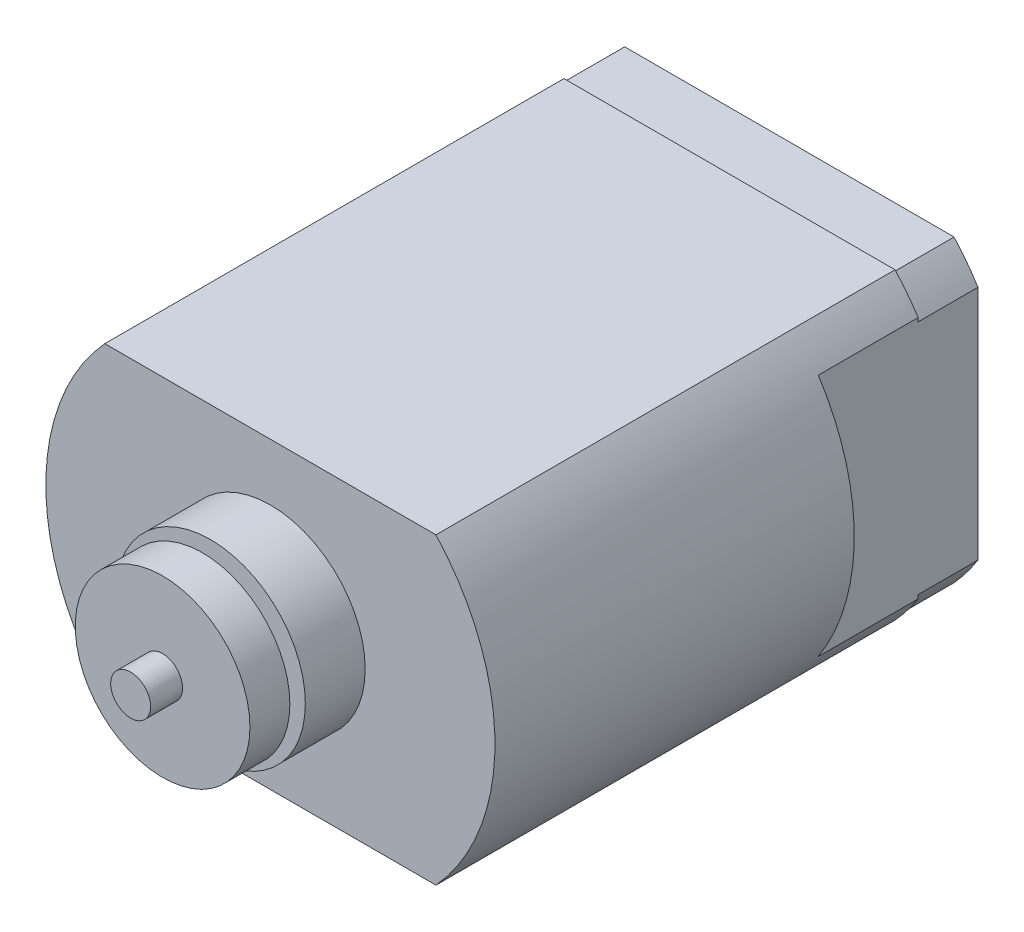
ISO-10303-21;
HEADER;
FILE_DESCRIPTION(('STEP AP214'),'2;1');
FILE_NAME('part.step','',(''),(''),'','','');
FILE_SCHEMA(('AUTOMOTIVE_DESIGN { 1 0 10303 214 1 1 1 1 }'));
ENDSEC;
DATA;
#1=APPLICATION_CONTEXT('core data for automotive mechanical design processes');
#2=APPLICATION_PROTOCOL_DEFINITION('international standard','automotive_design',2000,#1);
#3=PRODUCT_CONTEXT('',#1,'mechanical');
#4=PRODUCT('Part','Part','',(#3));
#5=PRODUCT_RELATED_PRODUCT_CATEGORY('part','',(#4));
#6=PRODUCT_DEFINITION_FORMATION('','',#4);
#7=PRODUCT_DEFINITION_CONTEXT('part definition',#1,'design');
#8=PRODUCT_DEFINITION('design','',#6,#7);
#9=PRODUCT_DEFINITION_SHAPE('','',#8);
#10=(LENGTH_UNIT() NAMED_UNIT(*) SI_UNIT(.MILLI.,.METRE.));
#11=(NAMED_UNIT(*) PLANE_ANGLE_UNIT() SI_UNIT($,.RADIAN.));
#12=(NAMED_UNIT(*) SI_UNIT($,.STERADIAN.) SOLID_ANGLE_UNIT());
#13=UNCERTAINTY_MEASURE_WITH_UNIT(LENGTH_MEASURE(1.E-05),#10,'distance_accuracy_value','');
#14=(GEOMETRIC_REPRESENTATION_CONTEXT(3) GLOBAL_UNCERTAINTY_ASSIGNED_CONTEXT((#13)) GLOBAL_UNIT_ASSIGNED_CONTEXT((#10,
#11,#12)) REPRESENTATION_CONTEXT('',''));
#15=CARTESIAN_POINT('',(0.,0.,0.));
#16=DIRECTION('',(0.,0.,1.));
#17=DIRECTION('',(1.,0.,0.));
#18=AXIS2_PLACEMENT_3D('',#15,#16,#17);
#19=CARTESIAN_POINT('',(0.,0.,3.));
#20=DIRECTION('',(0.,0.,-1.));
#21=DIRECTION('',(-1.,0.,0.));
#22=AXIS2_PLACEMENT_3D('',#19,#20,#21);
#23=CYLINDRICAL_SURFACE('',#22,11.15);
#24=DIRECTION('',(0.,0.,-1.));
#25=VECTOR('',#24,1.);
#26=CARTESIAN_POINT('',(9.45,5.9177698502054,3.));
#27=LINE('',#26,#25);
#28=CARTESIAN_POINT('',(9.45,5.9177698502054,0.));
#29=VERTEX_POINT('',#28);
#30=CARTESIAN_POINT('',(9.45,5.9177698502054,3.));
#31=VERTEX_POINT('',#30);
#32=EDGE_CURVE('E131',#29,#31,#27,.F.);
#33=ORIENTED_EDGE('',*,*,#32,.F.);
#34=CARTESIAN_POINT('',(0.,0.,0.));
#35=DIRECTION('',(0.,0.,-1.));
#36=DIRECTION('',(-1.,0.,0.));
#37=AXIS2_PLACEMENT_3D('',#34,#35,#36);
#38=CIRCLE('',#37,11.15);
#39=CARTESIAN_POINT('',(8.25060603834652,7.5,0.));
#40=VERTEX_POINT('',#39);
#41=EDGE_CURVE('E140',#40,#29,#38,.T.);
#42=ORIENTED_EDGE('',*,*,#41,.F.);
#43=DIRECTION('',(0.,0.,-1.));
#44=VECTOR('',#43,1.);
#45=CARTESIAN_POINT('',(8.25060603834652,7.5,3.));
#46=LINE('',#45,#44);
#47=CARTESIAN_POINT('',(8.25060603834652,7.5,3.));
#48=VERTEX_POINT('',#47);
#49=EDGE_CURVE('E166',#48,#40,#46,.T.);
#50=ORIENTED_EDGE('',*,*,#49,.F.);
#51=CARTESIAN_POINT('',(0.,0.,3.));
#52=DIRECTION('',(0.,0.,-1.));
#53=DIRECTION('',(-1.,0.,0.));
#54=AXIS2_PLACEMENT_3D('',#51,#52,#53);
#55=CIRCLE('',#54,11.15);
#56=EDGE_CURVE('E142',#48,#31,#55,.T.);
#57=ORIENTED_EDGE('',*,*,#56,.T.);
#58=EDGE_LOOP('',(#33,#42,#50,#57));
#59=FACE_BOUND('',#58,.T.);
#60=ADVANCED_FACE('F43',(#59),#23,.T.);
#61=CARTESIAN_POINT('',(0.,0.,26.));
#62=DIRECTION('',(0.,0.,-1.));
#63=DIRECTION('',(-1.,0.,0.));
#64=AXIS2_PLACEMENT_3D('',#61,#62,#63);
#65=CYLINDRICAL_SURFACE('',#64,11.25);
#66=CARTESIAN_POINT('',(0.,0.,3.));
#67=DIRECTION('',(0.,0.,-1.));
#68=DIRECTION('',(-1.,0.,0.));
#69=AXIS2_PLACEMENT_3D('',#66,#67,#68);
#70=CIRCLE('',#69,11.25);
#71=CARTESIAN_POINT('',(-8.29472724084403,-7.6,3.));
#72=VERTEX_POINT('',#71);
#73=CARTESIAN_POINT('',(-8.29472724084403,7.6,3.00000000000001));
#74=VERTEX_POINT('',#73);
#75=EDGE_CURVE('E66',#72,#74,#70,.T.);
#76=ORIENTED_EDGE('',*,*,#75,.F.);
#77=DIRECTION('',(0.,0.,-1.));
#78=VECTOR('',#77,1.);
#79=CARTESIAN_POINT('',(-8.29472724084403,-7.6,26.));
#80=LINE('',#79,#78);
#81=CARTESIAN_POINT('',(-8.29472724084403,-7.6,26.));
#82=VERTEX_POINT('',#81);
#83=EDGE_CURVE('E200',#82,#72,#80,.T.);
#84=ORIENTED_EDGE('',*,*,#83,.F.);
#85=CARTESIAN_POINT('',(0.,0.,26.));
#86=DIRECTION('',(0.,0.,1.));
#87=DIRECTION('',(1.,0.,0.));
#88=AXIS2_PLACEMENT_3D('',#85,#86,#87);
#89=CIRCLE('',#88,11.25);
#90=CARTESIAN_POINT('',(-8.29472724084403,7.6,26.));
#91=VERTEX_POINT('',#90);
#92=EDGE_CURVE('E197',#91,#82,#89,.T.);
#93=ORIENTED_EDGE('',*,*,#92,.F.);
#94=DIRECTION('',(0.,0.,-1.));
#95=VECTOR('',#94,1.);
#96=CARTESIAN_POINT('',(-8.29472724084403,7.6,26.));
#97=LINE('',#96,#95);
#98=EDGE_CURVE('E209',#91,#74,#97,.T.);
#99=ORIENTED_EDGE('',*,*,#98,.T.);
#100=EDGE_LOOP('',(#76,#84,#93,#99));
#101=FACE_BOUND('',#100,.T.);
#102=ADVANCED_FACE('F45',(#101),#65,.T.);
#103=CARTESIAN_POINT('',(-8.29472724084403,-7.6,26.));
#104=DIRECTION('',(0.,1.,0.));
#105=DIRECTION('',(0.,0.,1.));
#106=AXIS2_PLACEMENT_3D('',#103,#104,#105);
#107=PLANE('',#106);
#108=DIRECTION('',(-1.,0.,0.));
#109=VECTOR('',#108,1.);
#110=CARTESIAN_POINT('',(-8.29472724084403,-7.6,3.));
#111=LINE('',#110,#109);
#112=CARTESIAN_POINT('',(8.29472724084403,-7.6,3.));
#113=VERTEX_POINT('',#112);
#114=EDGE_CURVE('E174',#113,#72,#111,.T.);
#115=ORIENTED_EDGE('',*,*,#114,.F.);
#116=DIRECTION('',(0.,0.,-1.));
#117=VECTOR('',#116,1.);
#118=CARTESIAN_POINT('',(8.29472724084403,-7.6,26.));
#119=LINE('',#118,#117);
#120=CARTESIAN_POINT('',(8.29472724084403,-7.6,26.));
#121=VERTEX_POINT('',#120);
#122=EDGE_CURVE('E215',#121,#113,#119,.T.);
#123=ORIENTED_EDGE('',*,*,#122,.F.);
#124=DIRECTION('',(1.,0.,0.));
#125=VECTOR('',#124,1.);
#126=CARTESIAN_POINT('',(-8.29472724084403,-7.6,26.));
#127=LINE('',#126,#125);
#128=EDGE_CURVE('E203',#82,#121,#127,.T.);
#129=ORIENTED_EDGE('',*,*,#128,.F.);
#130=ORIENTED_EDGE('',*,*,#83,.T.);
#131=EDGE_LOOP('',(#115,#123,#129,#130));
#132=FACE_BOUND('',#131,.T.);
#133=ADVANCED_FACE('F277',(#132),#107,.F.);
#134=CARTESIAN_POINT('',(0.,0.,26.));
#135=DIRECTION('',(0.,0.,-1.));
#136=DIRECTION('',(-1.,0.,0.));
#137=AXIS2_PLACEMENT_3D('',#134,#135,#136);
#138=CYLINDRICAL_SURFACE('',#137,11.25);
#139=CARTESIAN_POINT('',(0.,0.,8.));
#140=DIRECTION('',(0.,0.,1.));
#141=DIRECTION('',(1.,0.,0.));
#142=AXIS2_PLACEMENT_3D('',#139,#140,#141);
#143=CIRCLE('',#142,11.25);
#144=CARTESIAN_POINT('',(9.45,-6.10409698481274,8.));
#145=VERTEX_POINT('',#144);
#146=CARTESIAN_POINT('',(9.45,6.10409698481274,8.));
#147=VERTEX_POINT('',#146);
#148=EDGE_CURVE('E12',#145,#147,#143,.T.);
#149=ORIENTED_EDGE('',*,*,#148,.T.);
#150=DIRECTION('',(0.,0.,-1.));
#151=VECTOR('',#150,1.);
#152=CARTESIAN_POINT('',(9.45,6.10409698481274,26.));
#153=LINE('',#152,#151);
#154=CARTESIAN_POINT('',(9.45,6.10409698481274,3.));
#155=VERTEX_POINT('',#154);
#156=EDGE_CURVE('E253',#147,#155,#153,.T.);
#157=ORIENTED_EDGE('',*,*,#156,.T.);
#158=CARTESIAN_POINT('',(0.,0.,3.));
#159=DIRECTION('',(0.,0.,-1.));
#160=DIRECTION('',(-1.,0.,0.));
#161=AXIS2_PLACEMENT_3D('',#158,#159,#160);
#162=CIRCLE('',#161,11.25);
#163=CARTESIAN_POINT('',(8.29472724084403,7.6,3.));
#164=VERTEX_POINT('',#163);
#165=EDGE_CURVE('E171',#164,#155,#162,.T.);
#166=ORIENTED_EDGE('',*,*,#165,.F.);
#167=DIRECTION('',(0.,0.,-1.));
#168=VECTOR('',#167,1.);
#169=CARTESIAN_POINT('',(8.29472724084403,7.6,26.));
#170=LINE('',#169,#168);
#171=CARTESIAN_POINT('',(8.29472724084403,7.6,26.));
#172=VERTEX_POINT('',#171);
#173=EDGE_CURVE('E212',#172,#164,#170,.T.);
#174=ORIENTED_EDGE('',*,*,#173,.F.);
#175=CARTESIAN_POINT('',(0.,0.,26.));
#176=DIRECTION('',(0.,0.,1.));
#177=DIRECTION('',(1.,0.,0.));
#178=AXIS2_PLACEMENT_3D('',#175,#176,#177);
#179=CIRCLE('',#178,11.25);
#180=EDGE_CURVE('E205',#121,#172,#179,.T.);
#181=ORIENTED_EDGE('',*,*,#180,.F.);
#182=ORIENTED_EDGE('',*,*,#122,.T.);
#183=CARTESIAN_POINT('',(9.45,-6.10409698481274,3.));
#184=VERTEX_POINT('',#183);
#185=EDGE_CURVE('E162',#184,#113,#162,.T.);
#186=ORIENTED_EDGE('',*,*,#185,.F.);
#187=DIRECTION('',(0.,0.,-1.));
#188=VECTOR('',#187,1.);
#189=CARTESIAN_POINT('',(9.45,-6.10409698481274,26.));
#190=LINE('',#189,#188);
#191=EDGE_CURVE('E144',#184,#145,#190,.F.);
#192=ORIENTED_EDGE('',*,*,#191,.T.);
#193=EDGE_LOOP('',(#149,#157,#166,#174,#181,#182,#186,#192));
#194=FACE_BOUND('',#193,.T.);
#195=ADVANCED_FACE('F270',(#194),#138,.T.);
#196=CARTESIAN_POINT('',(-8.29472724084403,7.6,26.));
#197=DIRECTION('',(0.,-1.,0.));
#198=DIRECTION('',(0.,0.,-1.));
#199=AXIS2_PLACEMENT_3D('',#196,#197,#198);
#200=PLANE('',#199);
#201=DIRECTION('',(1.,0.,0.));
#202=VECTOR('',#201,1.);
#203=CARTESIAN_POINT('',(8.29472724084403,7.6,3.));
#204=LINE('',#203,#202);
#205=EDGE_CURVE('E177',#74,#164,#204,.T.);
#206=ORIENTED_EDGE('',*,*,#205,.F.);
#207=ORIENTED_EDGE('',*,*,#98,.F.);
#208=DIRECTION('',(-1.,0.,0.));
#209=VECTOR('',#208,1.);
#210=CARTESIAN_POINT('',(-8.29472724084403,7.6,26.));
#211=LINE('',#210,#209);
#212=EDGE_CURVE('E207',#172,#91,#211,.T.);
#213=ORIENTED_EDGE('',*,*,#212,.F.);
#214=ORIENTED_EDGE('',*,*,#173,.T.);
#215=EDGE_LOOP('',(#206,#207,#213,#214));
#216=FACE_BOUND('',#215,.T.);
#217=ADVANCED_FACE('F284',(#216),#200,.F.);
#218=CARTESIAN_POINT('',(0.,0.,33.));
#219=DIRECTION('',(0.,0.,-1.));
#220=DIRECTION('',(-1.,0.,0.));
#221=AXIS2_PLACEMENT_3D('',#218,#219,#220);
#222=CYLINDRICAL_SURFACE('',#221,1.);
#223=CARTESIAN_POINT('',(0.,0.,29.));
#224=DIRECTION('',(0.,0.,1.));
#225=DIRECTION('',(1.,0.,0.));
#226=AXIS2_PLACEMENT_3D('',#223,#224,#225);
#227=CIRCLE('',#226,1.);
#228=CARTESIAN_POINT('',(1.,0.,29.));
#229=VERTEX_POINT('',#228);
#230=EDGE_CURVE('E190',#229,#229,#227,.T.);
#231=ORIENTED_EDGE('',*,*,#230,.T.);
#232=EDGE_LOOP('',(#231));
#233=FACE_BOUND('',#232,.T.);
#234=CARTESIAN_POINT('',(0.,0.,29.4));
#235=DIRECTION('',(0.,0.,1.));
#236=DIRECTION('',(1.,0.,0.));
#237=AXIS2_PLACEMENT_3D('',#234,#235,#236);
#238=CIRCLE('',#237,1.);
#239=CARTESIAN_POINT('',(1.,0.,29.4));
#240=VERTEX_POINT('',#239);
#241=EDGE_CURVE('E193',#240,#240,#238,.T.);
#242=ORIENTED_EDGE('',*,*,#241,.F.);
#243=EDGE_LOOP('',(#242));
#244=FACE_BOUND('',#243,.T.);
#245=ADVANCED_FACE('F291',(#233,#244),#222,.T.);
#246=CARTESIAN_POINT('',(0.,0.,26.));
#247=DIRECTION('',(0.,0.,1.));
#248=DIRECTION('',(1.,0.,0.));
#249=AXIS2_PLACEMENT_3D('',#246,#247,#248);
#250=PLANE('',#249);
#251=CARTESIAN_POINT('',(0.,0.,26.));
#252=DIRECTION('',(0.,0.,1.));
#253=DIRECTION('',(1.,0.,0.));
#254=AXIS2_PLACEMENT_3D('',#251,#252,#253);
#255=CIRCLE('',#254,4.75);
#256=CARTESIAN_POINT('',(4.75,0.,26.));
#257=VERTEX_POINT('',#256);
#258=EDGE_CURVE('E194',#257,#257,#255,.T.);
#259=ORIENTED_EDGE('',*,*,#258,.F.);
#260=EDGE_LOOP('',(#259));
#261=FACE_BOUND('',#260,.T.);
#262=ORIENTED_EDGE('',*,*,#92,.T.);
#263=ORIENTED_EDGE('',*,*,#128,.T.);
#264=ORIENTED_EDGE('',*,*,#180,.T.);
#265=ORIENTED_EDGE('',*,*,#212,.T.);
#266=EDGE_LOOP('',(#262,#263,#264,#265));
#267=FACE_BOUND('',#266,.T.);
#268=ADVANCED_FACE('F288',(#261,#267),#250,.T.);
#269=CARTESIAN_POINT('',(0.,0.,29.));
#270=DIRECTION('',(0.,0.,-1.));
#271=DIRECTION('',(-1.,0.,0.));
#272=AXIS2_PLACEMENT_3D('',#269,#270,#271);
#273=CYLINDRICAL_SURFACE('',#272,4.75);
#274=CARTESIAN_POINT('',(0.,0.,29.));
#275=DIRECTION('',(0.,0.,1.));
#276=DIRECTION('',(1.,0.,0.));
#277=AXIS2_PLACEMENT_3D('',#274,#275,#276);
#278=CIRCLE('',#277,4.75);
#279=CARTESIAN_POINT('',(4.75,0.,29.));
#280=VERTEX_POINT('',#279);
#281=EDGE_CURVE('E189',#280,#280,#278,.T.);
#282=ORIENTED_EDGE('',*,*,#281,.F.);
#283=EDGE_LOOP('',(#282));
#284=FACE_BOUND('',#283,.T.);
#285=ORIENTED_EDGE('',*,*,#258,.T.);
#286=EDGE_LOOP('',(#285));
#287=FACE_BOUND('',#286,.T.);
#288=ADVANCED_FACE('F290',(#284,#287),#273,.T.);
#289=CARTESIAN_POINT('',(0.,0.,29.));
#290=DIRECTION('',(0.,0.,1.));
#291=DIRECTION('',(1.,0.,0.));
#292=AXIS2_PLACEMENT_3D('',#289,#290,#291);
#293=PLANE('',#292);
#294=ORIENTED_EDGE('',*,*,#230,.F.);
#295=EDGE_LOOP('',(#294));
#296=FACE_BOUND('',#295,.T.);
#297=ORIENTED_EDGE('',*,*,#281,.T.);
#298=EDGE_LOOP('',(#297));
#299=FACE_BOUND('',#298,.T.);
#300=ADVANCED_FACE('F298',(#296,#299),#293,.T.);
#301=CARTESIAN_POINT('',(0.,0.,29.4));
#302=DIRECTION('',(0.,0.,1.));
#303=DIRECTION('',(1.,0.,0.));
#304=AXIS2_PLACEMENT_3D('',#301,#302,#303);
#305=CYLINDRICAL_SURFACE('',#304,4.375);
#306=CARTESIAN_POINT('',(0.,0.,29.4));
#307=DIRECTION('',(0.,0.,1.));
#308=DIRECTION('',(1.,0.,0.));
#309=AXIS2_PLACEMENT_3D('',#306,#307,#308);
#310=CIRCLE('',#309,4.375);
#311=CARTESIAN_POINT('',(4.375,0.,29.4));
#312=VERTEX_POINT('',#311);
#313=EDGE_CURVE('E180',#312,#312,#310,.T.);
#314=ORIENTED_EDGE('',*,*,#313,.T.);
#315=EDGE_LOOP('',(#314));
#316=FACE_BOUND('',#315,.T.);
#317=CARTESIAN_POINT('',(0.,0.,31.4));
#318=DIRECTION('',(0.,0.,1.));
#319=DIRECTION('',(1.,0.,0.));
#320=AXIS2_PLACEMENT_3D('',#317,#318,#319);
#321=CIRCLE('',#320,4.375);
#322=CARTESIAN_POINT('',(4.375,0.,31.4));
#323=VERTEX_POINT('',#322);
#324=EDGE_CURVE('E179',#323,#323,#321,.T.);
#325=ORIENTED_EDGE('',*,*,#324,.F.);
#326=EDGE_LOOP('',(#325));
#327=FACE_BOUND('',#326,.T.);
#328=ADVANCED_FACE('F342',(#316,#327),#305,.T.);
#329=CARTESIAN_POINT('',(0.,0.,29.4));
#330=DIRECTION('',(0.,0.,1.));
#331=DIRECTION('',(1.,0.,0.));
#332=AXIS2_PLACEMENT_3D('',#329,#330,#331);
#333=PLANE('',#332);
#334=ORIENTED_EDGE('',*,*,#241,.T.);
#335=EDGE_LOOP('',(#334));
#336=FACE_BOUND('',#335,.T.);
#337=ORIENTED_EDGE('',*,*,#313,.F.);
#338=EDGE_LOOP('',(#337));
#339=FACE_BOUND('',#338,.T.);
#340=ADVANCED_FACE('F338',(#336,#339),#333,.F.);
#341=CARTESIAN_POINT('',(0.,0.,31.4));
#342=DIRECTION('',(0.,0.,1.));
#343=DIRECTION('',(1.,0.,0.));
#344=AXIS2_PLACEMENT_3D('',#341,#342,#343);
#345=PLANE('',#344);
#346=CARTESIAN_POINT('',(0.,0.,31.4));
#347=DIRECTION('',(0.,0.,1.));
#348=DIRECTION('',(1.,0.,0.));
#349=AXIS2_PLACEMENT_3D('',#346,#347,#348);
#350=CIRCLE('',#349,1.);
#351=CARTESIAN_POINT('',(1.,0.,31.4));
#352=VERTEX_POINT('',#351);
#353=EDGE_CURVE('E183',#352,#352,#350,.T.);
#354=ORIENTED_EDGE('',*,*,#353,.F.);
#355=EDGE_LOOP('',(#354));
#356=FACE_BOUND('',#355,.T.);
#357=ORIENTED_EDGE('',*,*,#324,.T.);
#358=EDGE_LOOP('',(#357));
#359=FACE_BOUND('',#358,.T.);
#360=ADVANCED_FACE('F341',(#356,#359),#345,.T.);
#361=CARTESIAN_POINT('',(0.,0.,33.));
#362=DIRECTION('',(0.,0.,1.));
#363=DIRECTION('',(1.,0.,0.));
#364=AXIS2_PLACEMENT_3D('',#361,#362,#363);
#365=PLANE('',#364);
#366=CARTESIAN_POINT('',(0.,0.,33.));
#367=DIRECTION('',(0.,0.,1.));
#368=DIRECTION('',(1.,0.,0.));
#369=AXIS2_PLACEMENT_3D('',#366,#367,#368);
#370=CIRCLE('',#369,1.);
#371=CARTESIAN_POINT('',(1.,0.,33.));
#372=VERTEX_POINT('',#371);
#373=EDGE_CURVE('E186',#372,#372,#370,.T.);
#374=ORIENTED_EDGE('',*,*,#373,.T.);
#375=EDGE_LOOP('',(#374));
#376=FACE_BOUND('',#375,.T.);
#377=ADVANCED_FACE('F345',(#376),#365,.T.);
#378=ORIENTED_EDGE('',*,*,#353,.T.);
#379=EDGE_LOOP('',(#378));
#380=FACE_BOUND('',#379,.T.);
#381=ORIENTED_EDGE('',*,*,#373,.F.);
#382=EDGE_LOOP('',(#381));
#383=FACE_BOUND('',#382,.T.);
#384=ADVANCED_FACE('F303',(#380,#383),#222,.T.);
#385=CARTESIAN_POINT('',(0.,0.,3.));
#386=DIRECTION('',(0.,0.,-1.));
#387=DIRECTION('',(-1.,0.,0.));
#388=AXIS2_PLACEMENT_3D('',#385,#386,#387);
#389=PLANE('',#388);
#390=DIRECTION('',(0.,1.,0.));
#391=VECTOR('',#390,1.);
#392=CARTESIAN_POINT('',(9.45,0.,3.));
#393=LINE('',#392,#391);
#394=CARTESIAN_POINT('',(9.45,-5.9177698502054,3.));
#395=VERTEX_POINT('',#394);
#396=EDGE_CURVE('E259',#184,#395,#393,.T.);
#397=ORIENTED_EDGE('',*,*,#396,.F.);
#398=ORIENTED_EDGE('',*,*,#185,.T.);
#399=ORIENTED_EDGE('',*,*,#114,.T.);
#400=ORIENTED_EDGE('',*,*,#75,.T.);
#401=ORIENTED_EDGE('',*,*,#205,.T.);
#402=ORIENTED_EDGE('',*,*,#165,.T.);
#403=EDGE_CURVE('E143',#31,#155,#393,.T.);
#404=ORIENTED_EDGE('',*,*,#403,.F.);
#405=ORIENTED_EDGE('',*,*,#56,.F.);
#406=DIRECTION('',(1.,0.,0.));
#407=VECTOR('',#406,1.);
#408=CARTESIAN_POINT('',(-8.25060603834652,7.5,3.));
#409=LINE('',#408,#407);
#410=CARTESIAN_POINT('',(-8.25060603834652,7.5,3.));
#411=VERTEX_POINT('',#410);
#412=EDGE_CURVE('E235',#411,#48,#409,.T.);
#413=ORIENTED_EDGE('',*,*,#412,.F.);
#414=CARTESIAN_POINT('',(0.,0.,3.));
#415=DIRECTION('',(0.,0.,-1.));
#416=DIRECTION('',(-1.,0.,0.));
#417=AXIS2_PLACEMENT_3D('',#414,#415,#416);
#418=CIRCLE('',#417,11.15);
#419=CARTESIAN_POINT('',(-8.25060603834652,-7.5,3.));
#420=VERTEX_POINT('',#419);
#421=EDGE_CURVE('E155',#420,#411,#418,.T.);
#422=ORIENTED_EDGE('',*,*,#421,.F.);
#423=DIRECTION('',(-1.,0.,0.));
#424=VECTOR('',#423,1.);
#425=CARTESIAN_POINT('',(8.25060603834652,-7.5,3.));
#426=LINE('',#425,#424);
#427=CARTESIAN_POINT('',(8.25060603834652,-7.5,3.));
#428=VERTEX_POINT('',#427);
#429=EDGE_CURVE('E170',#428,#420,#426,.T.);
#430=ORIENTED_EDGE('',*,*,#429,.F.);
#431=EDGE_CURVE('E238',#395,#428,#55,.T.);
#432=ORIENTED_EDGE('',*,*,#431,.F.);
#433=EDGE_LOOP('',(#397,#398,#399,#400,#401,#402,#404,#405,#413,#422,#430,#432));
#434=FACE_BOUND('',#433,.T.);
#435=ADVANCED_FACE('F274',(#434),#389,.T.);
#436=CARTESIAN_POINT('',(0.,0.,3.));
#437=DIRECTION('',(0.,0.,-1.));
#438=DIRECTION('',(-1.,0.,0.));
#439=AXIS2_PLACEMENT_3D('',#436,#437,#438);
#440=CYLINDRICAL_SURFACE('',#439,11.15);
#441=CARTESIAN_POINT('',(0.,0.,0.));
#442=DIRECTION('',(0.,0.,-1.));
#443=DIRECTION('',(-1.,0.,0.));
#444=AXIS2_PLACEMENT_3D('',#441,#442,#443);
#445=CIRCLE('',#444,11.15);
#446=CARTESIAN_POINT('',(-8.25060603834652,-7.5,0.));
#447=VERTEX_POINT('',#446);
#448=CARTESIAN_POINT('',(-8.25060603834652,7.5,0.));
#449=VERTEX_POINT('',#448);
#450=EDGE_CURVE('E241',#447,#449,#445,.T.);
#451=ORIENTED_EDGE('',*,*,#450,.F.);
#452=DIRECTION('',(0.,0.,-1.));
#453=VECTOR('',#452,1.);
#454=CARTESIAN_POINT('',(-8.25060603834652,-7.5,3.));
#455=LINE('',#454,#453);
#456=EDGE_CURVE('E160',#420,#447,#455,.T.);
#457=ORIENTED_EDGE('',*,*,#456,.F.);
#458=ORIENTED_EDGE('',*,*,#421,.T.);
#459=DIRECTION('',(0.,0.,-1.));
#460=VECTOR('',#459,1.);
#461=CARTESIAN_POINT('',(-8.25060603834652,7.5,3.));
#462=LINE('',#461,#460);
#463=EDGE_CURVE('E168',#411,#449,#462,.T.);
#464=ORIENTED_EDGE('',*,*,#463,.T.);
#465=EDGE_LOOP('',(#451,#457,#458,#464));
#466=FACE_BOUND('',#465,.T.);
#467=ADVANCED_FACE('F323',(#466),#440,.T.);
#468=CARTESIAN_POINT('',(8.25060603834652,-7.5,3.));
#469=DIRECTION('',(0.,-1.,0.));
#470=DIRECTION('',(1.,0.,0.));
#471=AXIS2_PLACEMENT_3D('',#468,#469,#470);
#472=PLANE('',#471);
#473=DIRECTION('',(-1.,0.,0.));
#474=VECTOR('',#473,1.);
#475=CARTESIAN_POINT('',(8.25060603834652,-7.5,0.));
#476=LINE('',#475,#474);
#477=CARTESIAN_POINT('',(8.25060603834652,-7.5,0.));
#478=VERTEX_POINT('',#477);
#479=EDGE_CURVE('E151',#478,#447,#476,.T.);
#480=ORIENTED_EDGE('',*,*,#479,.F.);
#481=DIRECTION('',(0.,0.,-1.));
#482=VECTOR('',#481,1.);
#483=CARTESIAN_POINT('',(8.25060603834652,-7.5,3.));
#484=LINE('',#483,#482);
#485=EDGE_CURVE('E163',#428,#478,#484,.T.);
#486=ORIENTED_EDGE('',*,*,#485,.F.);
#487=ORIENTED_EDGE('',*,*,#429,.T.);
#488=ORIENTED_EDGE('',*,*,#456,.T.);
#489=EDGE_LOOP('',(#480,#486,#487,#488));
#490=FACE_BOUND('',#489,.T.);
#491=ADVANCED_FACE('F316',(#490),#472,.T.);
#492=DIRECTION('',(0.,0.,-1.));
#493=VECTOR('',#492,1.);
#494=CARTESIAN_POINT('',(9.45,-5.9177698502054,3.));
#495=LINE('',#494,#493);
#496=CARTESIAN_POINT('',(9.45,-5.9177698502054,0.));
#497=VERTEX_POINT('',#496);
#498=EDGE_CURVE('E58',#395,#497,#495,.T.);
#499=ORIENTED_EDGE('',*,*,#498,.F.);
#500=ORIENTED_EDGE('',*,*,#431,.T.);
#501=ORIENTED_EDGE('',*,*,#485,.T.);
#502=EDGE_CURVE('E152',#497,#478,#38,.T.);
#503=ORIENTED_EDGE('',*,*,#502,.F.);
#504=EDGE_LOOP('',(#499,#500,#501,#503));
#505=FACE_BOUND('',#504,.T.);
#506=ADVANCED_FACE('F308',(#505),#23,.T.);
#507=CARTESIAN_POINT('',(-8.25060603834652,7.5,3.));
#508=DIRECTION('',(0.,1.,0.));
#509=DIRECTION('',(0.,0.,1.));
#510=AXIS2_PLACEMENT_3D('',#507,#508,#509);
#511=PLANE('',#510);
#512=DIRECTION('',(1.,0.,0.));
#513=VECTOR('',#512,1.);
#514=CARTESIAN_POINT('',(-8.25060603834652,7.5,0.));
#515=LINE('',#514,#513);
#516=EDGE_CURVE('E150',#449,#40,#515,.T.);
#517=ORIENTED_EDGE('',*,*,#516,.F.);
#518=ORIENTED_EDGE('',*,*,#463,.F.);
#519=ORIENTED_EDGE('',*,*,#412,.T.);
#520=ORIENTED_EDGE('',*,*,#49,.T.);
#521=EDGE_LOOP('',(#517,#518,#519,#520));
#522=FACE_BOUND('',#521,.T.);
#523=ADVANCED_FACE('F315',(#522),#511,.T.);
#524=CARTESIAN_POINT('',(0.,0.,0.));
#525=DIRECTION('',(0.,0.,1.));
#526=DIRECTION('',(1.,0.,0.));
#527=AXIS2_PLACEMENT_3D('',#524,#525,#526);
#528=PLANE('',#527);
#529=CARTESIAN_POINT('',(0.,0.,0.));
#530=DIRECTION('',(0.,0.,-1.));
#531=DIRECTION('',(-1.,0.,0.));
#532=AXIS2_PLACEMENT_3D('',#529,#530,#531);
#533=CIRCLE('',#532,3.135);
#534=CARTESIAN_POINT('',(-3.135,0.,0.));
#535=VERTEX_POINT('',#534);
#536=EDGE_CURVE('E136',#535,#535,#533,.T.);
#537=ORIENTED_EDGE('',*,*,#536,.F.);
#538=EDGE_LOOP('',(#537));
#539=FACE_BOUND('',#538,.T.);
#540=ORIENTED_EDGE('',*,*,#41,.T.);
#541=DIRECTION('',(0.,-1.,0.));
#542=VECTOR('',#541,1.);
#543=CARTESIAN_POINT('',(9.45,0.,0.));
#544=LINE('',#543,#542);
#545=EDGE_CURVE('E51',#29,#497,#544,.T.);
#546=ORIENTED_EDGE('',*,*,#545,.T.);
#547=ORIENTED_EDGE('',*,*,#502,.T.);
#548=ORIENTED_EDGE('',*,*,#479,.T.);
#549=ORIENTED_EDGE('',*,*,#450,.T.);
#550=ORIENTED_EDGE('',*,*,#516,.T.);
#551=EDGE_LOOP('',(#540,#546,#547,#548,#549,#550));
#552=FACE_BOUND('',#551,.T.);
#553=ADVANCED_FACE('F147',(#539,#552),#528,.F.);
#554=CARTESIAN_POINT('',(0.,0.,-2.5));
#555=DIRECTION('',(0.,0.,1.));
#556=DIRECTION('',(1.,0.,0.));
#557=AXIS2_PLACEMENT_3D('',#554,#555,#556);
#558=CYLINDRICAL_SURFACE('',#557,3.135);
#559=CARTESIAN_POINT('',(0.,0.,-2.5));
#560=DIRECTION('',(0.,0.,-1.));
#561=DIRECTION('',(-1.,0.,0.));
#562=AXIS2_PLACEMENT_3D('',#559,#560,#561);
#563=CIRCLE('',#562,3.135);
#564=CARTESIAN_POINT('',(-3.135,0.,-2.5));
#565=VERTEX_POINT('',#564);
#566=EDGE_CURVE('E231',#565,#565,#563,.T.);
#567=ORIENTED_EDGE('',*,*,#566,.F.);
#568=EDGE_LOOP('',(#567));
#569=FACE_BOUND('',#568,.T.);
#570=ORIENTED_EDGE('',*,*,#536,.T.);
#571=EDGE_LOOP('',(#570));
#572=FACE_BOUND('',#571,.T.);
#573=ADVANCED_FACE('F416',(#569,#572),#558,.T.);
#574=CARTESIAN_POINT('',(0.,0.,-2.5));
#575=DIRECTION('',(0.,0.,-1.));
#576=DIRECTION('',(-1.,0.,0.));
#577=AXIS2_PLACEMENT_3D('',#574,#575,#576);
#578=PLANE('',#577);
#579=CARTESIAN_POINT('',(0.,0.,-2.5));
#580=DIRECTION('',(0.,0.,-1.));
#581=DIRECTION('',(-1.,0.,0.));
#582=AXIS2_PLACEMENT_3D('',#579,#580,#581);
#583=CIRCLE('',#582,1.25);
#584=CARTESIAN_POINT('',(-1.25,0.,-2.5));
#585=VERTEX_POINT('',#584);
#586=EDGE_CURVE('E248',#585,#585,#583,.T.);
#587=ORIENTED_EDGE('',*,*,#586,.F.);
#588=EDGE_LOOP('',(#587));
#589=FACE_BOUND('',#588,.T.);
#590=ORIENTED_EDGE('',*,*,#566,.T.);
#591=EDGE_LOOP('',(#590));
#592=FACE_BOUND('',#591,.T.);
#593=ADVANCED_FACE('F463',(#589,#592),#578,.T.);
#594=CARTESIAN_POINT('',(0.,0.,-1.5));
#595=DIRECTION('',(0.,0.,-1.));
#596=DIRECTION('',(-1.,0.,0.));
#597=AXIS2_PLACEMENT_3D('',#594,#595,#596);
#598=CYLINDRICAL_SURFACE('',#597,1.25);
#599=CARTESIAN_POINT('',(0.,0.,-1.5));
#600=DIRECTION('',(0.,0.,-1.));
#601=DIRECTION('',(-1.,0.,0.));
#602=AXIS2_PLACEMENT_3D('',#599,#600,#601);
#603=CIRCLE('',#602,1.25);
#604=CARTESIAN_POINT('',(-1.25,0.,-1.5));
#605=VERTEX_POINT('',#604);
#606=EDGE_CURVE('E244',#605,#605,#603,.T.);
#607=ORIENTED_EDGE('',*,*,#606,.F.);
#608=EDGE_LOOP('',(#607));
#609=FACE_BOUND('',#608,.T.);
#610=ORIENTED_EDGE('',*,*,#586,.T.);
#611=EDGE_LOOP('',(#610));
#612=FACE_BOUND('',#611,.T.);
#613=ADVANCED_FACE('F455',(#609,#612),#598,.F.);
#614=CARTESIAN_POINT('',(0.,0.,-1.5));
#615=DIRECTION('',(0.,0.,-1.));
#616=DIRECTION('',(-1.,0.,0.));
#617=AXIS2_PLACEMENT_3D('',#614,#615,#616);
#618=PLANE('',#617);
#619=ORIENTED_EDGE('',*,*,#606,.T.);
#620=EDGE_LOOP('',(#619));
#621=FACE_BOUND('',#620,.T.);
#622=ADVANCED_FACE('F427',(#621),#618,.T.);
#623=CARTESIAN_POINT('',(0.,0.,8.));
#624=DIRECTION('',(0.,0.,1.));
#625=DIRECTION('',(1.,0.,0.));
#626=AXIS2_PLACEMENT_3D('',#623,#624,#625);
#627=PLANE('',#626);
#628=ORIENTED_EDGE('',*,*,#148,.F.);
#629=DIRECTION('',(0.,1.,0.));
#630=VECTOR('',#629,1.);
#631=CARTESIAN_POINT('',(9.45,7.6,8.));
#632=LINE('',#631,#630);
#633=EDGE_CURVE('E262',#145,#147,#632,.T.);
#634=ORIENTED_EDGE('',*,*,#633,.T.);
#635=EDGE_LOOP('',(#628,#634));
#636=FACE_BOUND('',#635,.T.);
#637=ADVANCED_FACE('F265',(#636),#627,.F.);
#638=CARTESIAN_POINT('',(9.45,7.6,8.));
#639=DIRECTION('',(-1.,0.,0.));
#640=DIRECTION('',(0.,-1.,0.));
#641=AXIS2_PLACEMENT_3D('',#638,#639,#640);
#642=PLANE('',#641);
#643=ORIENTED_EDGE('',*,*,#633,.F.);
#644=ORIENTED_EDGE('',*,*,#191,.F.);
#645=ORIENTED_EDGE('',*,*,#396,.T.);
#646=ORIENTED_EDGE('',*,*,#498,.T.);
#647=ORIENTED_EDGE('',*,*,#545,.F.);
#648=ORIENTED_EDGE('',*,*,#32,.T.);
#649=ORIENTED_EDGE('',*,*,#403,.T.);
#650=ORIENTED_EDGE('',*,*,#156,.F.);
#651=EDGE_LOOP('',(#643,#644,#645,#646,#647,#648,#649,#650));
#652=FACE_BOUND('',#651,.T.);
#653=ADVANCED_FACE('F130',(#652),#642,.F.);
#654=CLOSED_SHELL('',(#60,#102,#133,#195,#217,#245,#268,#288,#300,#328,#340,#360,#377,#384,#435,
#467,#491,#506,#523,#553,#573,#593,#613,#622,#637,#653));
#655=MANIFOLD_SOLID_BREP('B2',#654);
#656=ADVANCED_BREP_SHAPE_REPRESENTATION('',(#18,#655),#14);
#657=SHAPE_DEFINITION_REPRESENTATION(#9,#656);
ENDSEC;
END-ISO-10303-21;
